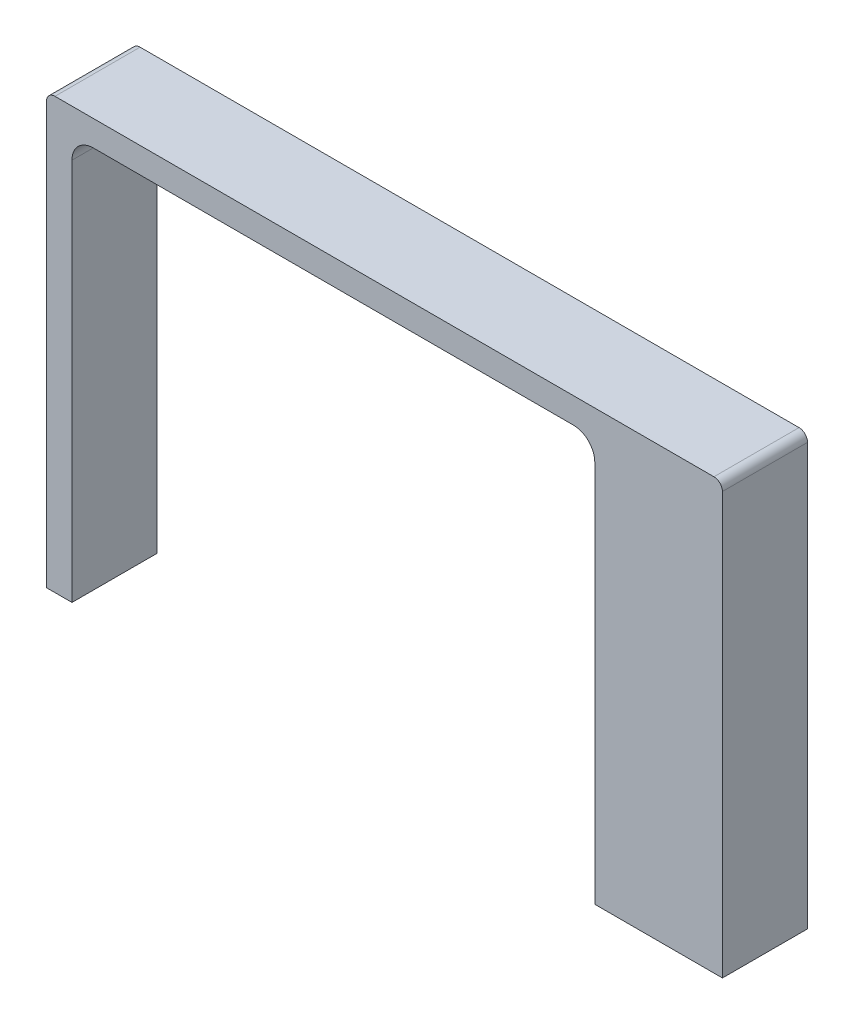
ISO-10303-21;
HEADER;
FILE_DESCRIPTION(('STEP AP214'),'2;1');
FILE_NAME('part.step','',(''),(''),'','','');
FILE_SCHEMA(('AUTOMOTIVE_DESIGN { 1 0 10303 214 1 1 1 1 }'));
ENDSEC;
DATA;
#1=APPLICATION_CONTEXT('core data for automotive mechanical design processes');
#2=APPLICATION_PROTOCOL_DEFINITION('international standard','automotive_design',2000,#1);
#3=PRODUCT_CONTEXT('',#1,'mechanical');
#4=PRODUCT('Part','Part','',(#3));
#5=PRODUCT_RELATED_PRODUCT_CATEGORY('part','',(#4));
#6=PRODUCT_DEFINITION_FORMATION('','',#4);
#7=PRODUCT_DEFINITION_CONTEXT('part definition',#1,'design');
#8=PRODUCT_DEFINITION('design','',#6,#7);
#9=PRODUCT_DEFINITION_SHAPE('','',#8);
#10=(LENGTH_UNIT() NAMED_UNIT(*) SI_UNIT(.MILLI.,.METRE.));
#11=(NAMED_UNIT(*) PLANE_ANGLE_UNIT() SI_UNIT($,.RADIAN.));
#12=(NAMED_UNIT(*) SI_UNIT($,.STERADIAN.) SOLID_ANGLE_UNIT());
#13=UNCERTAINTY_MEASURE_WITH_UNIT(LENGTH_MEASURE(1.E-05),#10,'distance_accuracy_value','');
#14=(GEOMETRIC_REPRESENTATION_CONTEXT(3) GLOBAL_UNCERTAINTY_ASSIGNED_CONTEXT((#13)) GLOBAL_UNIT_ASSIGNED_CONTEXT((#10,
#11,#12)) REPRESENTATION_CONTEXT('',''));
#15=CARTESIAN_POINT('',(0.,0.,0.));
#16=DIRECTION('',(0.,0.,1.));
#17=DIRECTION('',(1.,0.,0.));
#18=AXIS2_PLACEMENT_3D('',#15,#16,#17);
#19=CARTESIAN_POINT('',(100.8634,64.135,25.4));
#20=DIRECTION('',(-1.,0.,0.));
#21=DIRECTION('',(0.,-1.,0.));
#22=AXIS2_PLACEMENT_3D('',#19,#20,#21);
#23=PLANE('',#22);
#24=DIRECTION('',(0.,1.,0.));
#25=VECTOR('',#24,1.);
#26=CARTESIAN_POINT('',(100.8634,64.135,0.));
#27=LINE('',#26,#25);
#28=CARTESIAN_POINT('',(100.8634,-64.135,0.));
#29=VERTEX_POINT('',#28);
#30=CARTESIAN_POINT('',(100.8634,61.595,0.));
#31=VERTEX_POINT('',#30);
#32=EDGE_CURVE('E164',#29,#31,#27,.T.);
#33=ORIENTED_EDGE('',*,*,#32,.T.);
#34=DIRECTION('',(0.,0.,-1.));
#35=VECTOR('',#34,1.);
#36=CARTESIAN_POINT('',(100.8634,61.595,25.4));
#37=LINE('',#36,#35);
#38=CARTESIAN_POINT('',(100.8634,61.595,25.4));
#39=VERTEX_POINT('',#38);
#40=EDGE_CURVE('E11',#31,#39,#37,.F.);
#41=ORIENTED_EDGE('',*,*,#40,.T.);
#42=DIRECTION('',(0.,1.,0.));
#43=VECTOR('',#42,1.);
#44=CARTESIAN_POINT('',(100.8634,64.135,25.4));
#45=LINE('',#44,#43);
#46=CARTESIAN_POINT('',(100.8634,-64.135,25.4));
#47=VERTEX_POINT('',#46);
#48=EDGE_CURVE('E181',#47,#39,#45,.T.);
#49=ORIENTED_EDGE('',*,*,#48,.F.);
#50=DIRECTION('',(0.,0.,-1.));
#51=VECTOR('',#50,1.);
#52=CARTESIAN_POINT('',(100.8634,-64.135,25.4));
#53=LINE('',#52,#51);
#54=EDGE_CURVE('E163',#47,#29,#53,.T.);
#55=ORIENTED_EDGE('',*,*,#54,.T.);
#56=EDGE_LOOP('',(#33,#41,#49,#55));
#57=FACE_BOUND('',#56,.T.);
#58=ADVANCED_FACE('F35',(#57),#23,.F.);
#59=CARTESIAN_POINT('',(-100.8634,64.135,25.4));
#60=DIRECTION('',(0.,-1.,0.));
#61=DIRECTION('',(0.,0.,-1.));
#62=AXIS2_PLACEMENT_3D('',#59,#60,#61);
#63=PLANE('',#62);
#64=DIRECTION('',(-1.,0.,0.));
#65=VECTOR('',#64,1.);
#66=CARTESIAN_POINT('',(-100.8634,64.135,0.));
#67=LINE('',#66,#65);
#68=CARTESIAN_POINT('',(98.3233999999999,64.135,0.));
#69=VERTEX_POINT('',#68);
#70=CARTESIAN_POINT('',(-98.3234,64.135,0.));
#71=VERTEX_POINT('',#70);
#72=EDGE_CURVE('E166',#69,#71,#67,.T.);
#73=ORIENTED_EDGE('',*,*,#72,.T.);
#74=DIRECTION('',(0.,0.,-1.));
#75=VECTOR('',#74,1.);
#76=CARTESIAN_POINT('',(-98.3234,64.135,25.4));
#77=LINE('',#76,#75);
#78=CARTESIAN_POINT('',(-98.3234,64.135,25.4));
#79=VERTEX_POINT('',#78);
#80=EDGE_CURVE('E56',#71,#79,#77,.F.);
#81=ORIENTED_EDGE('',*,*,#80,.T.);
#82=DIRECTION('',(-1.,0.,0.));
#83=VECTOR('',#82,1.);
#84=CARTESIAN_POINT('',(-100.8634,64.135,25.4));
#85=LINE('',#84,#83);
#86=CARTESIAN_POINT('',(98.3233999999999,64.135,25.4));
#87=VERTEX_POINT('',#86);
#88=EDGE_CURVE('E136',#87,#79,#85,.T.);
#89=ORIENTED_EDGE('',*,*,#88,.F.);
#90=DIRECTION('',(0.,0.,-1.));
#91=VECTOR('',#90,1.);
#92=CARTESIAN_POINT('',(98.3234,64.135,25.4));
#93=LINE('',#92,#91);
#94=EDGE_CURVE('E211',#87,#69,#93,.T.);
#95=ORIENTED_EDGE('',*,*,#94,.T.);
#96=EDGE_LOOP('',(#73,#81,#89,#95));
#97=FACE_BOUND('',#96,.T.);
#98=ADVANCED_FACE('F219',(#97),#63,.F.);
#99=CARTESIAN_POINT('',(-100.8634,64.135,25.4));
#100=DIRECTION('',(1.,0.,0.));
#101=DIRECTION('',(0.,0.,-1.));
#102=AXIS2_PLACEMENT_3D('',#99,#100,#101);
#103=PLANE('',#102);
#104=DIRECTION('',(0.,-1.,0.));
#105=VECTOR('',#104,1.);
#106=CARTESIAN_POINT('',(-100.8634,64.135,25.4));
#107=LINE('',#106,#105);
#108=CARTESIAN_POINT('',(-100.8634,61.595,25.4));
#109=VERTEX_POINT('',#108);
#110=CARTESIAN_POINT('',(-100.8634,-64.135,25.4));
#111=VERTEX_POINT('',#110);
#112=EDGE_CURVE('E125',#109,#111,#107,.T.);
#113=ORIENTED_EDGE('',*,*,#112,.F.);
#114=DIRECTION('',(0.,0.,-1.));
#115=VECTOR('',#114,1.);
#116=CARTESIAN_POINT('',(-100.8634,61.595,25.4));
#117=LINE('',#116,#115);
#118=CARTESIAN_POINT('',(-100.8634,61.595,0.));
#119=VERTEX_POINT('',#118);
#120=EDGE_CURVE('E205',#109,#119,#117,.T.);
#121=ORIENTED_EDGE('',*,*,#120,.T.);
#122=DIRECTION('',(0.,-1.,0.));
#123=VECTOR('',#122,1.);
#124=CARTESIAN_POINT('',(-100.8634,64.135,0.));
#125=LINE('',#124,#123);
#126=CARTESIAN_POINT('',(-100.8634,-64.135,0.));
#127=VERTEX_POINT('',#126);
#128=EDGE_CURVE('E142',#119,#127,#125,.T.);
#129=ORIENTED_EDGE('',*,*,#128,.T.);
#130=DIRECTION('',(0.,0.,-1.));
#131=VECTOR('',#130,1.);
#132=CARTESIAN_POINT('',(-100.8634,-64.135,25.4));
#133=LINE('',#132,#131);
#134=EDGE_CURVE('E139',#111,#127,#133,.T.);
#135=ORIENTED_EDGE('',*,*,#134,.F.);
#136=EDGE_LOOP('',(#113,#121,#129,#135));
#137=FACE_BOUND('',#136,.T.);
#138=ADVANCED_FACE('F140',(#137),#103,.F.);
#139=CARTESIAN_POINT('',(-100.8634,-64.135,25.4));
#140=DIRECTION('',(0.,1.,0.));
#141=DIRECTION('',(0.,0.,1.));
#142=AXIS2_PLACEMENT_3D('',#139,#140,#141);
#143=PLANE('',#142);
#144=DIRECTION('',(1.,0.,0.));
#145=VECTOR('',#144,1.);
#146=CARTESIAN_POINT('',(-100.8634,-64.135,0.));
#147=LINE('',#146,#145);
#148=CARTESIAN_POINT('',(-93.2434,-64.135,0.));
#149=VERTEX_POINT('',#148);
#150=EDGE_CURVE('E169',#127,#149,#147,.T.);
#151=ORIENTED_EDGE('',*,*,#150,.T.);
#152=DIRECTION('',(0.,0.,-1.));
#153=VECTOR('',#152,1.);
#154=CARTESIAN_POINT('',(-93.2434,-64.135,25.4));
#155=LINE('',#154,#153);
#156=CARTESIAN_POINT('',(-93.2434,-64.135,25.4));
#157=VERTEX_POINT('',#156);
#158=EDGE_CURVE('E146',#157,#149,#155,.T.);
#159=ORIENTED_EDGE('',*,*,#158,.F.);
#160=DIRECTION('',(1.,0.,0.));
#161=VECTOR('',#160,1.);
#162=CARTESIAN_POINT('',(-100.8634,-64.135,25.4));
#163=LINE('',#162,#161);
#164=EDGE_CURVE('E130',#111,#157,#163,.T.);
#165=ORIENTED_EDGE('',*,*,#164,.F.);
#166=ORIENTED_EDGE('',*,*,#134,.T.);
#167=EDGE_LOOP('',(#151,#159,#165,#166));
#168=FACE_BOUND('',#167,.T.);
#169=ADVANCED_FACE('F148',(#168),#143,.F.);
#170=CARTESIAN_POINT('',(-93.2434,56.515,25.4));
#171=DIRECTION('',(-1.,0.,0.));
#172=DIRECTION('',(0.,-1.,0.));
#173=AXIS2_PLACEMENT_3D('',#170,#171,#172);
#174=PLANE('',#173);
#175=DIRECTION('',(0.,1.,0.));
#176=VECTOR('',#175,1.);
#177=CARTESIAN_POINT('',(-93.2434,56.515,0.));
#178=LINE('',#177,#176);
#179=CARTESIAN_POINT('',(-93.2434,50.165,0.));
#180=VERTEX_POINT('',#179);
#181=EDGE_CURVE('E171',#149,#180,#178,.T.);
#182=ORIENTED_EDGE('',*,*,#181,.T.);
#183=DIRECTION('',(0.,0.,-1.));
#184=VECTOR('',#183,1.);
#185=CARTESIAN_POINT('',(-93.2434,50.165,25.4));
#186=LINE('',#185,#184);
#187=CARTESIAN_POINT('',(-93.2434,50.165,25.4));
#188=VERTEX_POINT('',#187);
#189=EDGE_CURVE('E192',#180,#188,#186,.F.);
#190=ORIENTED_EDGE('',*,*,#189,.T.);
#191=DIRECTION('',(0.,1.,0.));
#192=VECTOR('',#191,1.);
#193=CARTESIAN_POINT('',(-93.2434,56.515,25.4));
#194=LINE('',#193,#192);
#195=EDGE_CURVE('E151',#157,#188,#194,.T.);
#196=ORIENTED_EDGE('',*,*,#195,.F.);
#197=ORIENTED_EDGE('',*,*,#158,.T.);
#198=EDGE_LOOP('',(#182,#190,#196,#197));
#199=FACE_BOUND('',#198,.T.);
#200=ADVANCED_FACE('F250',(#199),#174,.F.);
#201=CARTESIAN_POINT('',(62.7634,56.515,25.4));
#202=DIRECTION('',(0.,1.,0.));
#203=DIRECTION('',(-1.,0.,0.));
#204=AXIS2_PLACEMENT_3D('',#201,#202,#203);
#205=PLANE('',#204);
#206=DIRECTION('',(1.,0.,0.));
#207=VECTOR('',#206,1.);
#208=CARTESIAN_POINT('',(62.7634,56.515,25.4));
#209=LINE('',#208,#207);
#210=CARTESIAN_POINT('',(-86.8934,56.515,25.4));
#211=VERTEX_POINT('',#210);
#212=CARTESIAN_POINT('',(56.4134,56.515,25.4));
#213=VERTEX_POINT('',#212);
#214=EDGE_CURVE('E153',#211,#213,#209,.T.);
#215=ORIENTED_EDGE('',*,*,#214,.F.);
#216=DIRECTION('',(0.,0.,-1.));
#217=VECTOR('',#216,1.);
#218=CARTESIAN_POINT('',(-86.8934,56.515,0.));
#219=LINE('',#218,#217);
#220=CARTESIAN_POINT('',(-86.8934,56.515,0.));
#221=VERTEX_POINT('',#220);
#222=EDGE_CURVE('E189',#211,#221,#219,.T.);
#223=ORIENTED_EDGE('',*,*,#222,.T.);
#224=DIRECTION('',(1.,0.,0.));
#225=VECTOR('',#224,1.);
#226=CARTESIAN_POINT('',(62.7634,56.515,0.));
#227=LINE('',#226,#225);
#228=CARTESIAN_POINT('',(56.4134,56.515,0.));
#229=VERTEX_POINT('',#228);
#230=EDGE_CURVE('E174',#221,#229,#227,.T.);
#231=ORIENTED_EDGE('',*,*,#230,.T.);
#232=DIRECTION('',(0.,0.,-1.));
#233=VECTOR('',#232,1.);
#234=CARTESIAN_POINT('',(56.4134,56.515,25.4));
#235=LINE('',#234,#233);
#236=EDGE_CURVE('E145',#229,#213,#235,.F.);
#237=ORIENTED_EDGE('',*,*,#236,.T.);
#238=EDGE_LOOP('',(#215,#223,#231,#237));
#239=FACE_BOUND('',#238,.T.);
#240=ADVANCED_FACE('F242',(#239),#205,.F.);
#241=CARTESIAN_POINT('',(62.7634,56.515,25.4));
#242=DIRECTION('',(1.,0.,0.));
#243=DIRECTION('',(0.,1.,0.));
#244=AXIS2_PLACEMENT_3D('',#241,#242,#243);
#245=PLANE('',#244);
#246=DIRECTION('',(0.,-1.,0.));
#247=VECTOR('',#246,1.);
#248=CARTESIAN_POINT('',(62.7634,56.515,25.4));
#249=LINE('',#248,#247);
#250=CARTESIAN_POINT('',(62.7634,50.165,25.4));
#251=VERTEX_POINT('',#250);
#252=CARTESIAN_POINT('',(62.7634,-64.135,25.4));
#253=VERTEX_POINT('',#252);
#254=EDGE_CURVE('E159',#251,#253,#249,.T.);
#255=ORIENTED_EDGE('',*,*,#254,.F.);
#256=DIRECTION('',(0.,0.,-1.));
#257=VECTOR('',#256,1.);
#258=CARTESIAN_POINT('',(62.7634,50.165,0.));
#259=LINE('',#258,#257);
#260=CARTESIAN_POINT('',(62.7634,50.165,0.));
#261=VERTEX_POINT('',#260);
#262=EDGE_CURVE('E194',#251,#261,#259,.T.);
#263=ORIENTED_EDGE('',*,*,#262,.T.);
#264=DIRECTION('',(0.,-1.,0.));
#265=VECTOR('',#264,1.);
#266=CARTESIAN_POINT('',(62.7634,56.515,0.));
#267=LINE('',#266,#265);
#268=CARTESIAN_POINT('',(62.7634,-64.135,0.));
#269=VERTEX_POINT('',#268);
#270=EDGE_CURVE('E177',#261,#269,#267,.T.);
#271=ORIENTED_EDGE('',*,*,#270,.T.);
#272=DIRECTION('',(0.,0.,-1.));
#273=VECTOR('',#272,1.);
#274=CARTESIAN_POINT('',(62.7634,-64.135,25.4));
#275=LINE('',#274,#273);
#276=EDGE_CURVE('E184',#253,#269,#275,.T.);
#277=ORIENTED_EDGE('',*,*,#276,.F.);
#278=EDGE_LOOP('',(#255,#263,#271,#277));
#279=FACE_BOUND('',#278,.T.);
#280=ADVANCED_FACE('F234',(#279),#245,.F.);
#281=CARTESIAN_POINT('',(62.7634,-64.135,25.4));
#282=DIRECTION('',(0.,1.,0.));
#283=DIRECTION('',(0.,0.,1.));
#284=AXIS2_PLACEMENT_3D('',#281,#282,#283);
#285=PLANE('',#284);
#286=DIRECTION('',(1.,0.,0.));
#287=VECTOR('',#286,1.);
#288=CARTESIAN_POINT('',(62.7634,-64.135,0.));
#289=LINE('',#288,#287);
#290=EDGE_CURVE('E179',#269,#29,#289,.T.);
#291=ORIENTED_EDGE('',*,*,#290,.T.);
#292=ORIENTED_EDGE('',*,*,#54,.F.);
#293=DIRECTION('',(1.,0.,0.));
#294=VECTOR('',#293,1.);
#295=CARTESIAN_POINT('',(62.7634,-64.135,25.4));
#296=LINE('',#295,#294);
#297=EDGE_CURVE('E161',#253,#47,#296,.T.);
#298=ORIENTED_EDGE('',*,*,#297,.F.);
#299=ORIENTED_EDGE('',*,*,#276,.T.);
#300=EDGE_LOOP('',(#291,#292,#298,#299));
#301=FACE_BOUND('',#300,.T.);
#302=ADVANCED_FACE('F228',(#301),#285,.F.);
#303=CARTESIAN_POINT('',(0.,0.,25.4));
#304=DIRECTION('',(0.,0.,1.));
#305=DIRECTION('',(1.,0.,0.));
#306=AXIS2_PLACEMENT_3D('',#303,#304,#305);
#307=PLANE('',#306);
#308=ORIENTED_EDGE('',*,*,#88,.T.);
#309=CARTESIAN_POINT('',(-98.3234,61.595,25.4));
#310=DIRECTION('',(0.,0.,1.));
#311=DIRECTION('',(1.,0.,0.));
#312=AXIS2_PLACEMENT_3D('',#309,#310,#311);
#313=CIRCLE('',#312,2.54);
#314=EDGE_CURVE('E43',#79,#109,#313,.T.);
#315=ORIENTED_EDGE('',*,*,#314,.T.);
#316=ORIENTED_EDGE('',*,*,#112,.T.);
#317=ORIENTED_EDGE('',*,*,#164,.T.);
#318=ORIENTED_EDGE('',*,*,#195,.T.);
#319=CARTESIAN_POINT('',(-86.8934,50.165,25.4));
#320=DIRECTION('',(0.,0.,1.));
#321=DIRECTION('',(1.,0.,0.));
#322=AXIS2_PLACEMENT_3D('',#319,#320,#321);
#323=CIRCLE('',#322,6.35);
#324=EDGE_CURVE('E199',#188,#211,#323,.F.);
#325=ORIENTED_EDGE('',*,*,#324,.T.);
#326=ORIENTED_EDGE('',*,*,#214,.T.);
#327=CARTESIAN_POINT('',(56.4134,50.165,25.4));
#328=DIRECTION('',(0.,0.,1.));
#329=DIRECTION('',(1.,0.,0.));
#330=AXIS2_PLACEMENT_3D('',#327,#328,#329);
#331=CIRCLE('',#330,6.35);
#332=EDGE_CURVE('E203',#213,#251,#331,.F.);
#333=ORIENTED_EDGE('',*,*,#332,.T.);
#334=ORIENTED_EDGE('',*,*,#254,.T.);
#335=ORIENTED_EDGE('',*,*,#297,.T.);
#336=ORIENTED_EDGE('',*,*,#48,.T.);
#337=CARTESIAN_POINT('',(98.3234,61.595,25.4));
#338=DIRECTION('',(0.,0.,1.));
#339=DIRECTION('',(1.,0.,0.));
#340=AXIS2_PLACEMENT_3D('',#337,#338,#339);
#341=CIRCLE('',#340,2.54);
#342=EDGE_CURVE('E215',#39,#87,#341,.T.);
#343=ORIENTED_EDGE('',*,*,#342,.T.);
#344=EDGE_LOOP('',(#308,#315,#316,#317,#318,#325,#326,#333,#334,#335,#336,#343));
#345=FACE_BOUND('',#344,.T.);
#346=ADVANCED_FACE('F127',(#345),#307,.T.);
#347=CARTESIAN_POINT('',(0.,0.,0.));
#348=DIRECTION('',(0.,0.,1.));
#349=DIRECTION('',(1.,0.,0.));
#350=AXIS2_PLACEMENT_3D('',#347,#348,#349);
#351=PLANE('',#350);
#352=ORIENTED_EDGE('',*,*,#128,.F.);
#353=CARTESIAN_POINT('',(-98.3234,61.595,0.));
#354=DIRECTION('',(0.,0.,1.));
#355=DIRECTION('',(1.,0.,0.));
#356=AXIS2_PLACEMENT_3D('',#353,#354,#355);
#357=CIRCLE('',#356,2.54);
#358=EDGE_CURVE('E209',#119,#71,#357,.F.);
#359=ORIENTED_EDGE('',*,*,#358,.T.);
#360=ORIENTED_EDGE('',*,*,#72,.F.);
#361=CARTESIAN_POINT('',(98.3234,61.595,0.));
#362=DIRECTION('',(0.,0.,1.));
#363=DIRECTION('',(1.,0.,0.));
#364=AXIS2_PLACEMENT_3D('',#361,#362,#363);
#365=CIRCLE('',#364,2.54);
#366=EDGE_CURVE('E207',#69,#31,#365,.F.);
#367=ORIENTED_EDGE('',*,*,#366,.T.);
#368=ORIENTED_EDGE('',*,*,#32,.F.);
#369=ORIENTED_EDGE('',*,*,#290,.F.);
#370=ORIENTED_EDGE('',*,*,#270,.F.);
#371=CARTESIAN_POINT('',(56.4134,50.165,0.));
#372=DIRECTION('',(0.,0.,1.));
#373=DIRECTION('',(1.,0.,0.));
#374=AXIS2_PLACEMENT_3D('',#371,#372,#373);
#375=CIRCLE('',#374,6.35);
#376=EDGE_CURVE('E201',#261,#229,#375,.T.);
#377=ORIENTED_EDGE('',*,*,#376,.T.);
#378=ORIENTED_EDGE('',*,*,#230,.F.);
#379=CARTESIAN_POINT('',(-86.8934,50.165,0.));
#380=DIRECTION('',(0.,0.,1.));
#381=DIRECTION('',(1.,0.,0.));
#382=AXIS2_PLACEMENT_3D('',#379,#380,#381);
#383=CIRCLE('',#382,6.35);
#384=EDGE_CURVE('E197',#221,#180,#383,.T.);
#385=ORIENTED_EDGE('',*,*,#384,.T.);
#386=ORIENTED_EDGE('',*,*,#181,.F.);
#387=ORIENTED_EDGE('',*,*,#150,.F.);
#388=EDGE_LOOP('',(#352,#359,#360,#367,#368,#369,#370,#377,#378,#385,#386,#387));
#389=FACE_BOUND('',#388,.T.);
#390=ADVANCED_FACE('F223',(#389),#351,.F.);
#391=CARTESIAN_POINT('',(-86.8934,50.165,25.4));
#392=DIRECTION('',(0.,0.,1.));
#393=DIRECTION('',(1.,0.,0.));
#394=AXIS2_PLACEMENT_3D('',#391,#392,#393);
#395=CYLINDRICAL_SURFACE('',#394,6.35);
#396=ORIENTED_EDGE('',*,*,#324,.F.);
#397=ORIENTED_EDGE('',*,*,#189,.F.);
#398=ORIENTED_EDGE('',*,*,#384,.F.);
#399=ORIENTED_EDGE('',*,*,#222,.F.);
#400=EDGE_LOOP('',(#396,#397,#398,#399));
#401=FACE_BOUND('',#400,.T.);
#402=ADVANCED_FACE('F247',(#401),#395,.F.);
#403=CARTESIAN_POINT('',(56.4134,50.165,25.4));
#404=DIRECTION('',(0.,0.,1.));
#405=DIRECTION('',(1.,0.,0.));
#406=AXIS2_PLACEMENT_3D('',#403,#404,#405);
#407=CYLINDRICAL_SURFACE('',#406,6.35);
#408=ORIENTED_EDGE('',*,*,#332,.F.);
#409=ORIENTED_EDGE('',*,*,#236,.F.);
#410=ORIENTED_EDGE('',*,*,#376,.F.);
#411=ORIENTED_EDGE('',*,*,#262,.F.);
#412=EDGE_LOOP('',(#408,#409,#410,#411));
#413=FACE_BOUND('',#412,.T.);
#414=ADVANCED_FACE('F238',(#413),#407,.F.);
#415=CARTESIAN_POINT('',(-98.3234,61.595,25.4));
#416=DIRECTION('',(0.,0.,-1.));
#417=DIRECTION('',(-1.,0.,0.));
#418=AXIS2_PLACEMENT_3D('',#415,#416,#417);
#419=CYLINDRICAL_SURFACE('',#418,2.54);
#420=ORIENTED_EDGE('',*,*,#314,.F.);
#421=ORIENTED_EDGE('',*,*,#80,.F.);
#422=ORIENTED_EDGE('',*,*,#358,.F.);
#423=ORIENTED_EDGE('',*,*,#120,.F.);
#424=EDGE_LOOP('',(#420,#421,#422,#423));
#425=FACE_BOUND('',#424,.T.);
#426=ADVANCED_FACE('F270',(#425),#419,.T.);
#427=CARTESIAN_POINT('',(98.3234,61.595,25.4));
#428=DIRECTION('',(0.,0.,-1.));
#429=DIRECTION('',(-1.,0.,0.));
#430=AXIS2_PLACEMENT_3D('',#427,#428,#429);
#431=CYLINDRICAL_SURFACE('',#430,2.54);
#432=ORIENTED_EDGE('',*,*,#342,.F.);
#433=ORIENTED_EDGE('',*,*,#40,.F.);
#434=ORIENTED_EDGE('',*,*,#366,.F.);
#435=ORIENTED_EDGE('',*,*,#94,.F.);
#436=EDGE_LOOP('',(#432,#433,#434,#435));
#437=FACE_BOUND('',#436,.T.);
#438=ADVANCED_FACE('F37',(#437),#431,.T.);
#439=CLOSED_SHELL('',(#58,#98,#138,#169,#200,#240,#280,#302,#346,#390,#402,#414,#426,#438));
#440=MANIFOLD_SOLID_BREP('B2',#439);
#441=ADVANCED_BREP_SHAPE_REPRESENTATION('',(#18,#440),#14);
#442=SHAPE_DEFINITION_REPRESENTATION(#9,#441);
ENDSEC;
END-ISO-10303-21;
